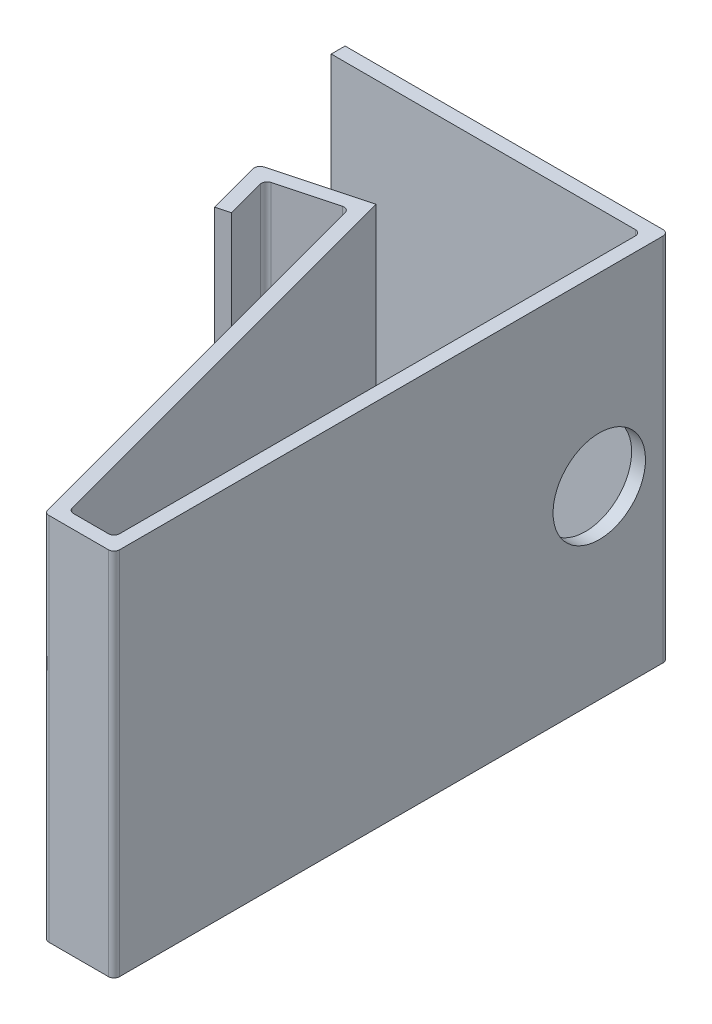
ISO-10303-21;
HEADER;
FILE_DESCRIPTION(('STEP AP214'),'2;1');
FILE_NAME('part.step','',(''),(''),'','','');
FILE_SCHEMA(('AUTOMOTIVE_DESIGN { 1 0 10303 214 1 1 1 1 }'));
ENDSEC;
DATA;
#1=APPLICATION_CONTEXT('core data for automotive mechanical design processes');
#2=APPLICATION_PROTOCOL_DEFINITION('international standard','automotive_design',2000,#1);
#3=PRODUCT_CONTEXT('',#1,'mechanical');
#4=PRODUCT('Part','Part','',(#3));
#5=PRODUCT_RELATED_PRODUCT_CATEGORY('part','',(#4));
#6=PRODUCT_DEFINITION_FORMATION('','',#4);
#7=PRODUCT_DEFINITION_CONTEXT('part definition',#1,'design');
#8=PRODUCT_DEFINITION('design','',#6,#7);
#9=PRODUCT_DEFINITION_SHAPE('','',#8);
#10=(LENGTH_UNIT() NAMED_UNIT(*) SI_UNIT(.MILLI.,.METRE.));
#11=(NAMED_UNIT(*) PLANE_ANGLE_UNIT() SI_UNIT($,.RADIAN.));
#12=(NAMED_UNIT(*) SI_UNIT($,.STERADIAN.) SOLID_ANGLE_UNIT());
#13=UNCERTAINTY_MEASURE_WITH_UNIT(LENGTH_MEASURE(1.E-05),#10,'distance_accuracy_value','');
#14=(GEOMETRIC_REPRESENTATION_CONTEXT(3) GLOBAL_UNCERTAINTY_ASSIGNED_CONTEXT((#13)) GLOBAL_UNIT_ASSIGNED_CONTEXT((#10,
#11,#12)) REPRESENTATION_CONTEXT('',''));
#15=CARTESIAN_POINT('',(0.,0.,0.));
#16=DIRECTION('',(0.,0.,1.));
#17=DIRECTION('',(1.,0.,0.));
#18=AXIS2_PLACEMENT_3D('',#15,#16,#17);
#19=CARTESIAN_POINT('',(-35.,0.,60.));
#20=DIRECTION('',(0.,1.,0.));
#21=DIRECTION('',(1.,0.,0.));
#22=AXIS2_PLACEMENT_3D('',#19,#20,#21);
#23=PLANE('',#22);
#24=CARTESIAN_POINT('',(-1.2,0.,118.8));
#25=DIRECTION('',(0.,1.,0.));
#26=DIRECTION('',(0.707106781186555,0.,0.70710678118654));
#27=AXIS2_PLACEMENT_3D('',#24,#25,#26);
#28=CIRCLE('',#27,1.2);
#29=CARTESIAN_POINT('',(-1.2,0.,120.));
#30=VERTEX_POINT('',#29);
#31=CARTESIAN_POINT('',(0.,0.,118.8));
#32=VERTEX_POINT('',#31);
#33=EDGE_CURVE('E383',#30,#32,#28,.T.);
#34=ORIENTED_EDGE('',*,*,#33,.F.);
#35=DIRECTION('',(-1.,0.,0.));
#36=VECTOR('',#35,1.);
#37=CARTESIAN_POINT('',(0.,0.,120.));
#38=LINE('',#37,#36);
#39=CARTESIAN_POINT('',(-14.0792076144252,0.,120.));
#40=VERTEX_POINT('',#39);
#41=EDGE_CURVE('E404',#30,#40,#38,.T.);
#42=ORIENTED_EDGE('',*,*,#41,.T.);
#43=CARTESIAN_POINT('',(-14.0792076144252,0.,118.8));
#44=DIRECTION('',(0.,1.,0.));
#45=DIRECTION('',(-0.608761429008726,0.,0.793353340291231));
#46=AXIS2_PLACEMENT_3D('',#43,#44,#45);
#47=CIRCLE('',#46,1.2);
#48=CARTESIAN_POINT('',(-15.2383186059721,0.,119.110582854123));
#49=VERTEX_POINT('',#48);
#50=EDGE_CURVE('E392',#49,#40,#47,.T.);
#51=ORIENTED_EDGE('',*,*,#50,.F.);
#52=DIRECTION('',(-0.258819045102521,0.,-0.965925826289068));
#53=VECTOR('',#52,1.);
#54=CARTESIAN_POINT('',(-15.,0.,120.));
#55=LINE('',#54,#53);
#56=CARTESIAN_POINT('',(-38.804844464678,0.,31.1591109915469));
#57=VERTEX_POINT('',#56);
#58=EDGE_CURVE('E502',#49,#57,#55,.T.);
#59=ORIENTED_EDGE('',*,*,#58,.T.);
#60=CARTESIAN_POINT('',(-39.9639554562249,0.,31.4696938456699));
#61=DIRECTION('',(0.,-1.,0.));
#62=DIRECTION('',(0.5,0.,-0.866025403784438));
#63=AXIS2_PLACEMENT_3D('',#60,#61,#62);
#64=CIRCLE('',#63,1.2);
#65=CARTESIAN_POINT('',(-40.2745383103479,0.,30.310582854123));
#66=VERTEX_POINT('',#65);
#67=EDGE_CURVE('E320',#66,#57,#64,.T.);
#68=ORIENTED_EDGE('',*,*,#67,.F.);
#69=DIRECTION('',(-0.965925826289069,0.,0.25881904510252));
#70=VECTOR('',#69,1.);
#71=CARTESIAN_POINT('',(-39.115427318801,0.,30.));
#72=LINE('',#71,#70);
#73=CARTESIAN_POINT('',(-52.4452037215902,0.,33.5717028224148));
#74=VERTEX_POINT('',#73);
#75=EDGE_CURVE('E346',#66,#74,#72,.T.);
#76=ORIENTED_EDGE('',*,*,#75,.T.);
#77=CARTESIAN_POINT('',(-52.1346208674672,0.,34.7308138139617));
#78=DIRECTION('',(0.,-1.,0.));
#79=DIRECTION('',(-0.866025403784442,0.,-0.5));
#80=AXIS2_PLACEMENT_3D('',#77,#78,#79);
#81=CIRCLE('',#80,1.2);
#82=CARTESIAN_POINT('',(-53.293731859014,0.,35.0413966680847));
#83=VERTEX_POINT('',#82);
#84=EDGE_CURVE('E321',#83,#74,#81,.T.);
#85=ORIENTED_EDGE('',*,*,#84,.F.);
#86=DIRECTION('',(0.258819045102521,0.,0.965925826289068));
#87=VECTOR('',#86,1.);
#88=CARTESIAN_POINT('',(-53.6043147131371,0.,33.8822856765378));
#89=LINE('',#88,#87);
#90=CARTESIAN_POINT('',(-51.0161242621119,0.,43.5415439394285));
#91=VERTEX_POINT('',#90);
#92=EDGE_CURVE('E456',#83,#91,#89,.T.);
#93=ORIENTED_EDGE('',*,*,#92,.T.);
#94=DIRECTION('',(0.965925826289068,0.,-0.258819045102522));
#95=VECTOR('',#94,1.);
#96=CARTESIAN_POINT('',(-53.9139017409791,0.,44.3180010747361));
#97=LINE('',#96,#95);
#98=CARTESIAN_POINT('',(-53.9139017409791,0.,44.3180010747361));
#99=VERTEX_POINT('',#98);
#100=EDGE_CURVE('E453',#99,#91,#97,.T.);
#101=ORIENTED_EDGE('',*,*,#100,.F.);
#102=DIRECTION('',(0.25881904510252,0.,0.965925826289069));
#103=VECTOR('',#102,1.);
#104=CARTESIAN_POINT('',(-57.2785493273118,0.,31.7609653329782));
#105=LINE('',#104,#103);
#106=CARTESIAN_POINT('',(-56.9679664731888,0.,32.920076324525));
#107=VERTEX_POINT('',#106);
#108=EDGE_CURVE('E43',#107,#99,#105,.T.);
#109=ORIENTED_EDGE('',*,*,#108,.F.);
#110=CARTESIAN_POINT('',(-55.8088554816419,0.,32.609493470402));
#111=DIRECTION('',(0.,1.,0.));
#112=DIRECTION('',(-0.866025403784439,0.,-0.5));
#113=AXIS2_PLACEMENT_3D('',#110,#111,#112);
#114=CIRCLE('',#113,1.2);
#115=CARTESIAN_POINT('',(-56.1194383357649,0.,31.4503824788551));
#116=VERTEX_POINT('',#115);
#117=EDGE_CURVE('E519',#116,#107,#114,.T.);
#118=ORIENTED_EDGE('',*,*,#117,.F.);
#119=DIRECTION('',(-0.965925826289068,0.,0.258819045102521));
#120=VECTOR('',#119,1.);
#121=CARTESIAN_POINT('',(-36.9941069752414,0.,26.3257653858252));
#122=LINE('',#121,#120);
#123=CARTESIAN_POINT('',(-36.9941069752414,0.,26.3257653858252));
#124=VERTEX_POINT('',#123);
#125=EDGE_CURVE('E437',#124,#116,#122,.T.);
#126=ORIENTED_EDGE('',*,*,#125,.F.);
#127=DIRECTION('',(-0.258819045102521,0.,-0.965925826289068));
#128=VECTOR('',#127,1.);
#129=CARTESIAN_POINT('',(-12.6980190360631,0.,117.));
#130=LINE('',#129,#128);
#131=CARTESIAN_POINT('',(-12.9363376420352,0.,116.110582854123));
#132=VERTEX_POINT('',#131);
#133=EDGE_CURVE('E524',#132,#124,#130,.T.);
#134=ORIENTED_EDGE('',*,*,#133,.F.);
#135=CARTESIAN_POINT('',(-11.7772266504884,0.,115.8));
#136=DIRECTION('',(0.,-1.,0.));
#137=DIRECTION('',(-0.608761429008716,0.,0.793353340291239));
#138=AXIS2_PLACEMENT_3D('',#135,#136,#137);
#139=CIRCLE('',#138,1.2);
#140=CARTESIAN_POINT('',(-11.7772266504884,0.,117.));
#141=VERTEX_POINT('',#140);
#142=EDGE_CURVE('E565',#141,#132,#139,.T.);
#143=ORIENTED_EDGE('',*,*,#142,.F.);
#144=DIRECTION('',(-1.,0.,0.));
#145=VECTOR('',#144,1.);
#146=CARTESIAN_POINT('',(-3.,0.,117.));
#147=LINE('',#146,#145);
#148=CARTESIAN_POINT('',(-4.2,0.,117.));
#149=VERTEX_POINT('',#148);
#150=EDGE_CURVE('E428',#149,#141,#147,.T.);
#151=ORIENTED_EDGE('',*,*,#150,.F.);
#152=CARTESIAN_POINT('',(-4.2,0.,115.8));
#153=DIRECTION('',(0.,-1.,0.));
#154=DIRECTION('',(0.707106781186545,0.,0.70710678118655));
#155=AXIS2_PLACEMENT_3D('',#152,#153,#154);
#156=CIRCLE('',#155,1.2);
#157=CARTESIAN_POINT('',(-3.,0.,115.8));
#158=VERTEX_POINT('',#157);
#159=EDGE_CURVE('E375',#158,#149,#156,.T.);
#160=ORIENTED_EDGE('',*,*,#159,.F.);
#161=DIRECTION('',(0.,0.,1.));
#162=VECTOR('',#161,1.);
#163=CARTESIAN_POINT('',(-3.,0.,3.));
#164=LINE('',#163,#162);
#165=CARTESIAN_POINT('',(-3.,0.,4.2));
#166=VERTEX_POINT('',#165);
#167=EDGE_CURVE('E359',#166,#158,#164,.T.);
#168=ORIENTED_EDGE('',*,*,#167,.F.);
#169=CARTESIAN_POINT('',(-4.2,0.,4.2));
#170=DIRECTION('',(0.,-1.,0.));
#171=DIRECTION('',(0.707106781186548,0.,-0.707106781186547));
#172=AXIS2_PLACEMENT_3D('',#169,#170,#171);
#173=CIRCLE('',#172,1.2);
#174=CARTESIAN_POINT('',(-4.2,0.,3.));
#175=VERTEX_POINT('',#174);
#176=EDGE_CURVE('E532',#175,#166,#173,.T.);
#177=ORIENTED_EDGE('',*,*,#176,.F.);
#178=DIRECTION('',(1.,0.,0.));
#179=VECTOR('',#178,1.);
#180=CARTESIAN_POINT('',(-70.,0.,3.));
#181=LINE('',#180,#179);
#182=CARTESIAN_POINT('',(-70.,0.,3.));
#183=VERTEX_POINT('',#182);
#184=EDGE_CURVE('E23',#183,#175,#181,.T.);
#185=ORIENTED_EDGE('',*,*,#184,.F.);
#186=DIRECTION('',(0.,0.,1.));
#187=VECTOR('',#186,1.);
#188=CARTESIAN_POINT('',(-70.,0.,0.));
#189=LINE('',#188,#187);
#190=CARTESIAN_POINT('',(-70.,0.,0.));
#191=VERTEX_POINT('',#190);
#192=EDGE_CURVE('E9',#191,#183,#189,.T.);
#193=ORIENTED_EDGE('',*,*,#192,.F.);
#194=DIRECTION('',(1.,0.,0.));
#195=VECTOR('',#194,1.);
#196=CARTESIAN_POINT('',(-70.,0.,0.));
#197=LINE('',#196,#195);
#198=CARTESIAN_POINT('',(-1.2,0.,0.));
#199=VERTEX_POINT('',#198);
#200=EDGE_CURVE('E299',#191,#199,#197,.T.);
#201=ORIENTED_EDGE('',*,*,#200,.T.);
#202=CARTESIAN_POINT('',(-1.2,0.,1.2));
#203=DIRECTION('',(0.,1.,0.));
#204=DIRECTION('',(0.707106781186547,0.,-0.707106781186548));
#205=AXIS2_PLACEMENT_3D('',#202,#203,#204);
#206=CIRCLE('',#205,1.2);
#207=CARTESIAN_POINT('',(0.,0.,1.2));
#208=VERTEX_POINT('',#207);
#209=EDGE_CURVE('E300',#208,#199,#206,.T.);
#210=ORIENTED_EDGE('',*,*,#209,.F.);
#211=DIRECTION('',(0.,0.,1.));
#212=VECTOR('',#211,1.);
#213=CARTESIAN_POINT('',(0.,0.,0.));
#214=LINE('',#213,#212);
#215=EDGE_CURVE('E520',#208,#32,#214,.T.);
#216=ORIENTED_EDGE('',*,*,#215,.T.);
#217=EDGE_LOOP('',(#34,#42,#51,#59,#68,#76,#85,#93,#101,#109,#118,#126,#134,#143,#151,#160,#168,
#177,#185,#193,#201,#210,#216));
#218=FACE_BOUND('',#217,.T.);
#219=ADVANCED_FACE('F15',(#218),#23,.F.);
#220=CARTESIAN_POINT('',(-70.,0.,0.));
#221=DIRECTION('',(-1.,0.,0.));
#222=DIRECTION('',(0.,0.,1.));
#223=AXIS2_PLACEMENT_3D('',#220,#221,#222);
#224=PLANE('',#223);
#225=ORIENTED_EDGE('',*,*,#192,.T.);
#226=DIRECTION('',(0.,1.,0.));
#227=VECTOR('',#226,1.);
#228=CARTESIAN_POINT('',(-70.,0.,3.));
#229=LINE('',#228,#227);
#230=CARTESIAN_POINT('',(-70.,80.,3.));
#231=VERTEX_POINT('',#230);
#232=EDGE_CURVE('E435',#183,#231,#229,.T.);
#233=ORIENTED_EDGE('',*,*,#232,.T.);
#234=DIRECTION('',(0.,0.,1.));
#235=VECTOR('',#234,1.);
#236=CARTESIAN_POINT('',(-70.,80.,0.));
#237=LINE('',#236,#235);
#238=CARTESIAN_POINT('',(-70.,80.,0.));
#239=VERTEX_POINT('',#238);
#240=EDGE_CURVE('E420',#239,#231,#237,.T.);
#241=ORIENTED_EDGE('',*,*,#240,.F.);
#242=DIRECTION('',(0.,1.,0.));
#243=VECTOR('',#242,1.);
#244=CARTESIAN_POINT('',(-70.,0.,0.));
#245=LINE('',#244,#243);
#246=EDGE_CURVE('E553',#191,#239,#245,.T.);
#247=ORIENTED_EDGE('',*,*,#246,.F.);
#248=EDGE_LOOP('',(#225,#233,#241,#247));
#249=FACE_BOUND('',#248,.T.);
#250=ADVANCED_FACE('F606',(#249),#224,.T.);
#251=CARTESIAN_POINT('',(-70.,0.,3.));
#252=DIRECTION('',(0.,0.,1.));
#253=DIRECTION('',(1.,0.,0.));
#254=AXIS2_PLACEMENT_3D('',#251,#252,#253);
#255=PLANE('',#254);
#256=DIRECTION('',(0.,-1.,0.));
#257=VECTOR('',#256,1.);
#258=CARTESIAN_POINT('',(-4.2,0.,3.));
#259=LINE('',#258,#257);
#260=CARTESIAN_POINT('',(-4.2,80.,3.));
#261=VERTEX_POINT('',#260);
#262=EDGE_CURVE('E364',#261,#175,#259,.T.);
#263=ORIENTED_EDGE('',*,*,#262,.F.);
#264=DIRECTION('',(1.,0.,0.));
#265=VECTOR('',#264,1.);
#266=CARTESIAN_POINT('',(-70.,80.,3.));
#267=LINE('',#266,#265);
#268=EDGE_CURVE('E424',#231,#261,#267,.T.);
#269=ORIENTED_EDGE('',*,*,#268,.F.);
#270=ORIENTED_EDGE('',*,*,#232,.F.);
#271=ORIENTED_EDGE('',*,*,#184,.T.);
#272=EDGE_LOOP('',(#263,#269,#270,#271));
#273=FACE_BOUND('',#272,.T.);
#274=ADVANCED_FACE('F587',(#273),#255,.T.);
#275=CARTESIAN_POINT('',(-57.2785493273118,0.,31.7609653329782));
#276=DIRECTION('',(-0.965925826289068,0.,0.25881904510252));
#277=DIRECTION('',(0.,1.,0.));
#278=AXIS2_PLACEMENT_3D('',#275,#276,#277);
#279=PLANE('',#278);
#280=DIRECTION('',(0.,1.,0.));
#281=VECTOR('',#280,1.);
#282=CARTESIAN_POINT('',(-56.9679664731888,0.,32.920076324525));
#283=LINE('',#282,#281);
#284=CARTESIAN_POINT('',(-56.9679664731888,80.,32.920076324525));
#285=VERTEX_POINT('',#284);
#286=EDGE_CURVE('E528',#107,#285,#283,.T.);
#287=ORIENTED_EDGE('',*,*,#286,.F.);
#288=ORIENTED_EDGE('',*,*,#108,.T.);
#289=DIRECTION('',(0.,1.,0.));
#290=VECTOR('',#289,1.);
#291=CARTESIAN_POINT('',(-53.9139017409791,0.,44.3180010747361));
#292=LINE('',#291,#290);
#293=CARTESIAN_POINT('',(-53.9139017409791,80.,44.3180010747361));
#294=VERTEX_POINT('',#293);
#295=EDGE_CURVE('E436',#99,#294,#292,.T.);
#296=ORIENTED_EDGE('',*,*,#295,.T.);
#297=DIRECTION('',(0.25881904510252,0.,0.965925826289069));
#298=VECTOR('',#297,1.);
#299=CARTESIAN_POINT('',(-57.2785493273118,80.,31.7609653329782));
#300=LINE('',#299,#298);
#301=EDGE_CURVE('E486',#285,#294,#300,.T.);
#302=ORIENTED_EDGE('',*,*,#301,.F.);
#303=EDGE_LOOP('',(#287,#288,#296,#302));
#304=FACE_BOUND('',#303,.T.);
#305=ADVANCED_FACE('F652',(#304),#279,.T.);
#306=CARTESIAN_POINT('',(-53.9139017409791,0.,44.3180010747361));
#307=DIRECTION('',(0.258819045102522,0.,0.965925826289068));
#308=DIRECTION('',(0.,-1.,0.));
#309=AXIS2_PLACEMENT_3D('',#306,#307,#308);
#310=PLANE('',#309);
#311=ORIENTED_EDGE('',*,*,#100,.T.);
#312=DIRECTION('',(0.,1.,0.));
#313=VECTOR('',#312,1.);
#314=CARTESIAN_POINT('',(-51.0161242621119,0.,43.5415439394285));
#315=LINE('',#314,#313);
#316=CARTESIAN_POINT('',(-51.0161242621119,80.,43.5415439394285));
#317=VERTEX_POINT('',#316);
#318=EDGE_CURVE('E523',#91,#317,#315,.T.);
#319=ORIENTED_EDGE('',*,*,#318,.T.);
#320=DIRECTION('',(0.965925826289068,0.,-0.258819045102522));
#321=VECTOR('',#320,1.);
#322=CARTESIAN_POINT('',(-53.9139017409791,80.,44.3180010747361));
#323=LINE('',#322,#321);
#324=EDGE_CURVE('E462',#294,#317,#323,.T.);
#325=ORIENTED_EDGE('',*,*,#324,.F.);
#326=ORIENTED_EDGE('',*,*,#295,.F.);
#327=EDGE_LOOP('',(#311,#319,#325,#326));
#328=FACE_BOUND('',#327,.T.);
#329=ADVANCED_FACE('F650',(#328),#310,.T.);
#330=CARTESIAN_POINT('',(-51.0161242621119,0.,43.5415439394285));
#331=DIRECTION('',(0.965925826289068,0.,-0.258819045102521));
#332=DIRECTION('',(0.,-1.,0.));
#333=AXIS2_PLACEMENT_3D('',#330,#331,#332);
#334=PLANE('',#333);
#335=DIRECTION('',(0.,-1.,0.));
#336=VECTOR('',#335,1.);
#337=CARTESIAN_POINT('',(-53.293731859014,0.,35.0413966680847));
#338=LINE('',#337,#336);
#339=CARTESIAN_POINT('',(-53.293731859014,80.,35.0413966680847));
#340=VERTEX_POINT('',#339);
#341=EDGE_CURVE('E316',#340,#83,#338,.T.);
#342=ORIENTED_EDGE('',*,*,#341,.F.);
#343=DIRECTION('',(-0.258819045102521,0.,-0.965925826289068));
#344=VECTOR('',#343,1.);
#345=CARTESIAN_POINT('',(-53.6043147131371,80.,33.8822856765378));
#346=LINE('',#345,#344);
#347=EDGE_CURVE('E457',#317,#340,#346,.T.);
#348=ORIENTED_EDGE('',*,*,#347,.F.);
#349=ORIENTED_EDGE('',*,*,#318,.F.);
#350=ORIENTED_EDGE('',*,*,#92,.F.);
#351=EDGE_LOOP('',(#342,#348,#349,#350));
#352=FACE_BOUND('',#351,.T.);
#353=ADVANCED_FACE('F647',(#352),#334,.T.);
#354=CARTESIAN_POINT('',(0.,0.,120.));
#355=DIRECTION('',(1.,0.,0.));
#356=DIRECTION('',(0.,1.,0.));
#357=AXIS2_PLACEMENT_3D('',#354,#355,#356);
#358=PLANE('',#357);
#359=CARTESIAN_POINT('',(0.,40.,15.));
#360=DIRECTION('',(-1.,0.,0.));
#361=DIRECTION('',(0.,1.,0.));
#362=AXIS2_PLACEMENT_3D('',#359,#360,#361);
#363=CIRCLE('',#362,10.);
#364=CARTESIAN_POINT('',(0.,30.,15.));
#365=VERTEX_POINT('',#364);
#366=EDGE_CURVE('E354',#365,#365,#363,.T.);
#367=ORIENTED_EDGE('',*,*,#366,.T.);
#368=EDGE_LOOP('',(#367));
#369=FACE_BOUND('',#368,.T.);
#370=DIRECTION('',(0.,1.,0.));
#371=VECTOR('',#370,1.);
#372=CARTESIAN_POINT('',(0.,0.,118.8));
#373=LINE('',#372,#371);
#374=CARTESIAN_POINT('',(0.,80.,118.8));
#375=VERTEX_POINT('',#374);
#376=EDGE_CURVE('E387',#32,#375,#373,.T.);
#377=ORIENTED_EDGE('',*,*,#376,.F.);
#378=ORIENTED_EDGE('',*,*,#215,.F.);
#379=DIRECTION('',(0.,-1.,0.));
#380=VECTOR('',#379,1.);
#381=CARTESIAN_POINT('',(0.,0.,1.2));
#382=LINE('',#381,#380);
#383=CARTESIAN_POINT('',(0.,80.,1.2));
#384=VERTEX_POINT('',#383);
#385=EDGE_CURVE('E544',#384,#208,#382,.T.);
#386=ORIENTED_EDGE('',*,*,#385,.F.);
#387=DIRECTION('',(0.,0.,-1.));
#388=VECTOR('',#387,1.);
#389=CARTESIAN_POINT('',(0.,80.,0.));
#390=LINE('',#389,#388);
#391=EDGE_CURVE('E408',#375,#384,#390,.T.);
#392=ORIENTED_EDGE('',*,*,#391,.F.);
#393=EDGE_LOOP('',(#377,#378,#386,#392));
#394=FACE_BOUND('',#393,.T.);
#395=ADVANCED_FACE('F616',(#369,#394),#358,.T.);
#396=CARTESIAN_POINT('',(-12.6980190360631,0.,117.));
#397=DIRECTION('',(0.965925826289068,0.,-0.258819045102521));
#398=DIRECTION('',(0.,-1.,0.));
#399=AXIS2_PLACEMENT_3D('',#396,#397,#398);
#400=PLANE('',#399);
#401=DIRECTION('',(0.,1.,0.));
#402=VECTOR('',#401,1.);
#403=CARTESIAN_POINT('',(-12.9363376420353,0.,116.110582854123));
#404=LINE('',#403,#402);
#405=CARTESIAN_POINT('',(-12.9363376420352,80.,116.110582854123));
#406=VERTEX_POINT('',#405);
#407=EDGE_CURVE('E571',#132,#406,#404,.T.);
#408=ORIENTED_EDGE('',*,*,#407,.F.);
#409=ORIENTED_EDGE('',*,*,#133,.T.);
#410=DIRECTION('',(0.,1.,0.));
#411=VECTOR('',#410,1.);
#412=CARTESIAN_POINT('',(-36.9941069752414,0.,26.3257653858252));
#413=LINE('',#412,#411);
#414=CARTESIAN_POINT('',(-36.9941069752414,80.,26.3257653858252));
#415=VERTEX_POINT('',#414);
#416=EDGE_CURVE('E440',#124,#415,#413,.T.);
#417=ORIENTED_EDGE('',*,*,#416,.T.);
#418=DIRECTION('',(-0.258819045102521,0.,-0.965925826289068));
#419=VECTOR('',#418,1.);
#420=CARTESIAN_POINT('',(-12.6980190360631,80.,117.));
#421=LINE('',#420,#419);
#422=EDGE_CURVE('E474',#406,#415,#421,.T.);
#423=ORIENTED_EDGE('',*,*,#422,.F.);
#424=EDGE_LOOP('',(#408,#409,#417,#423));
#425=FACE_BOUND('',#424,.T.);
#426=ADVANCED_FACE('F663',(#425),#400,.T.);
#427=CARTESIAN_POINT('',(-11.7772266504884,0.,115.8));
#428=DIRECTION('',(0.,1.,0.));
#429=DIRECTION('',(-0.608761429008716,0.,0.793353340291239));
#430=AXIS2_PLACEMENT_3D('',#427,#428,#429);
#431=CYLINDRICAL_SURFACE('',#430,1.2);
#432=ORIENTED_EDGE('',*,*,#142,.T.);
#433=ORIENTED_EDGE('',*,*,#407,.T.);
#434=CARTESIAN_POINT('',(-11.7772266504884,80.,115.8));
#435=DIRECTION('',(0.,1.,0.));
#436=DIRECTION('',(-0.608761429008716,0.,0.793353340291239));
#437=AXIS2_PLACEMENT_3D('',#434,#435,#436);
#438=CIRCLE('',#437,1.2);
#439=CARTESIAN_POINT('',(-11.7772266504884,80.,117.));
#440=VERTEX_POINT('',#439);
#441=EDGE_CURVE('E466',#406,#440,#438,.T.);
#442=ORIENTED_EDGE('',*,*,#441,.T.);
#443=DIRECTION('',(0.,-1.,0.));
#444=VECTOR('',#443,1.);
#445=CARTESIAN_POINT('',(-11.7772266504884,0.,117.));
#446=LINE('',#445,#444);
#447=EDGE_CURVE('E511',#440,#141,#446,.T.);
#448=ORIENTED_EDGE('',*,*,#447,.T.);
#449=EDGE_LOOP('',(#432,#433,#442,#448));
#450=FACE_BOUND('',#449,.T.);
#451=ADVANCED_FACE('F666',(#450),#431,.F.);
#452=CARTESIAN_POINT('',(-3.,0.,117.));
#453=DIRECTION('',(0.,0.,-1.));
#454=DIRECTION('',(0.,-1.,0.));
#455=AXIS2_PLACEMENT_3D('',#452,#453,#454);
#456=PLANE('',#455);
#457=DIRECTION('',(0.,1.,0.));
#458=VECTOR('',#457,1.);
#459=CARTESIAN_POINT('',(-4.2,0.,117.));
#460=LINE('',#459,#458);
#461=CARTESIAN_POINT('',(-4.2,80.,117.));
#462=VERTEX_POINT('',#461);
#463=EDGE_CURVE('E425',#149,#462,#460,.T.);
#464=ORIENTED_EDGE('',*,*,#463,.F.);
#465=ORIENTED_EDGE('',*,*,#150,.T.);
#466=ORIENTED_EDGE('',*,*,#447,.F.);
#467=DIRECTION('',(-1.,0.,0.));
#468=VECTOR('',#467,1.);
#469=CARTESIAN_POINT('',(-3.,80.,117.));
#470=LINE('',#469,#468);
#471=EDGE_CURVE('E452',#462,#440,#470,.T.);
#472=ORIENTED_EDGE('',*,*,#471,.F.);
#473=EDGE_LOOP('',(#464,#465,#466,#472));
#474=FACE_BOUND('',#473,.T.);
#475=ADVANCED_FACE('F670',(#474),#456,.T.);
#476=CARTESIAN_POINT('',(-4.2,0.,115.8));
#477=DIRECTION('',(0.,1.,0.));
#478=DIRECTION('',(0.707106781186545,0.,0.70710678118655));
#479=AXIS2_PLACEMENT_3D('',#476,#477,#478);
#480=CYLINDRICAL_SURFACE('',#479,1.2);
#481=ORIENTED_EDGE('',*,*,#159,.T.);
#482=ORIENTED_EDGE('',*,*,#463,.T.);
#483=CARTESIAN_POINT('',(-4.2,80.,115.8));
#484=DIRECTION('',(0.,1.,0.));
#485=DIRECTION('',(0.707106781186545,0.,0.70710678118655));
#486=AXIS2_PLACEMENT_3D('',#483,#484,#485);
#487=CIRCLE('',#486,1.2);
#488=CARTESIAN_POINT('',(-3.,80.,115.8));
#489=VERTEX_POINT('',#488);
#490=EDGE_CURVE('E448',#462,#489,#487,.T.);
#491=ORIENTED_EDGE('',*,*,#490,.T.);
#492=DIRECTION('',(0.,-1.,0.));
#493=VECTOR('',#492,1.);
#494=CARTESIAN_POINT('',(-3.,0.,115.8));
#495=LINE('',#494,#493);
#496=EDGE_CURVE('E363',#489,#158,#495,.T.);
#497=ORIENTED_EDGE('',*,*,#496,.T.);
#498=EDGE_LOOP('',(#481,#482,#491,#497));
#499=FACE_BOUND('',#498,.T.);
#500=ADVANCED_FACE('F672',(#499),#480,.F.);
#501=CARTESIAN_POINT('',(-3.,0.,3.));
#502=DIRECTION('',(-1.,0.,0.));
#503=DIRECTION('',(0.,0.,1.));
#504=AXIS2_PLACEMENT_3D('',#501,#502,#503);
#505=PLANE('',#504);
#506=CARTESIAN_POINT('',(-3.,40.,15.));
#507=DIRECTION('',(1.,0.,0.));
#508=DIRECTION('',(0.,1.,0.));
#509=AXIS2_PLACEMENT_3D('',#506,#507,#508);
#510=CIRCLE('',#509,10.);
#511=CARTESIAN_POINT('',(-3.,30.,15.));
#512=VERTEX_POINT('',#511);
#513=EDGE_CURVE('E368',#512,#512,#510,.T.);
#514=ORIENTED_EDGE('',*,*,#513,.T.);
#515=EDGE_LOOP('',(#514));
#516=FACE_BOUND('',#515,.T.);
#517=DIRECTION('',(0.,1.,0.));
#518=VECTOR('',#517,1.);
#519=CARTESIAN_POINT('',(-3.,0.,4.2));
#520=LINE('',#519,#518);
#521=CARTESIAN_POINT('',(-3.,80.,4.2));
#522=VERTEX_POINT('',#521);
#523=EDGE_CURVE('E529',#166,#522,#520,.T.);
#524=ORIENTED_EDGE('',*,*,#523,.F.);
#525=ORIENTED_EDGE('',*,*,#167,.T.);
#526=ORIENTED_EDGE('',*,*,#496,.F.);
#527=DIRECTION('',(0.,0.,1.));
#528=VECTOR('',#527,1.);
#529=CARTESIAN_POINT('',(-3.,80.,3.));
#530=LINE('',#529,#528);
#531=EDGE_CURVE('E444',#522,#489,#530,.T.);
#532=ORIENTED_EDGE('',*,*,#531,.F.);
#533=EDGE_LOOP('',(#524,#525,#526,#532));
#534=FACE_BOUND('',#533,.T.);
#535=ADVANCED_FACE('F598',(#516,#534),#505,.T.);
#536=CARTESIAN_POINT('',(-4.2,0.,4.2));
#537=DIRECTION('',(0.,1.,0.));
#538=DIRECTION('',(0.707106781186548,0.,-0.707106781186547));
#539=AXIS2_PLACEMENT_3D('',#536,#537,#538);
#540=CYLINDRICAL_SURFACE('',#539,1.2);
#541=ORIENTED_EDGE('',*,*,#176,.T.);
#542=ORIENTED_EDGE('',*,*,#523,.T.);
#543=CARTESIAN_POINT('',(-4.2,80.,4.2));
#544=DIRECTION('',(0.,1.,0.));
#545=DIRECTION('',(0.707106781186548,0.,-0.707106781186547));
#546=AXIS2_PLACEMENT_3D('',#543,#544,#545);
#547=CIRCLE('',#546,1.2);
#548=EDGE_CURVE('E432',#522,#261,#547,.T.);
#549=ORIENTED_EDGE('',*,*,#548,.T.);
#550=ORIENTED_EDGE('',*,*,#262,.T.);
#551=EDGE_LOOP('',(#541,#542,#549,#550));
#552=FACE_BOUND('',#551,.T.);
#553=ADVANCED_FACE('F592',(#552),#540,.F.);
#554=CARTESIAN_POINT('',(0.,0.,0.));
#555=DIRECTION('',(0.,0.,-1.));
#556=DIRECTION('',(0.,-1.,0.));
#557=AXIS2_PLACEMENT_3D('',#554,#555,#556);
#558=PLANE('',#557);
#559=DIRECTION('',(0.,1.,0.));
#560=VECTOR('',#559,1.);
#561=CARTESIAN_POINT('',(-1.2,0.,0.));
#562=LINE('',#561,#560);
#563=CARTESIAN_POINT('',(-1.2,80.,0.));
#564=VERTEX_POINT('',#563);
#565=EDGE_CURVE('E296',#199,#564,#562,.T.);
#566=ORIENTED_EDGE('',*,*,#565,.F.);
#567=ORIENTED_EDGE('',*,*,#200,.F.);
#568=ORIENTED_EDGE('',*,*,#246,.T.);
#569=DIRECTION('',(-1.,0.,0.));
#570=VECTOR('',#569,1.);
#571=CARTESIAN_POINT('',(-70.,80.,0.));
#572=LINE('',#571,#570);
#573=EDGE_CURVE('E416',#564,#239,#572,.T.);
#574=ORIENTED_EDGE('',*,*,#573,.F.);
#575=EDGE_LOOP('',(#566,#567,#568,#574));
#576=FACE_BOUND('',#575,.T.);
#577=ADVANCED_FACE('F610',(#576),#558,.T.);
#578=CARTESIAN_POINT('',(-1.2,0.,1.2));
#579=DIRECTION('',(0.,1.,0.));
#580=DIRECTION('',(0.707106781186547,0.,-0.707106781186548));
#581=AXIS2_PLACEMENT_3D('',#578,#579,#580);
#582=CYLINDRICAL_SURFACE('',#581,1.2);
#583=CARTESIAN_POINT('',(-1.2,80.,1.2));
#584=DIRECTION('',(0.,-1.,0.));
#585=DIRECTION('',(0.707106781186547,0.,-0.707106781186548));
#586=AXIS2_PLACEMENT_3D('',#583,#584,#585);
#587=CIRCLE('',#586,1.2);
#588=EDGE_CURVE('E412',#564,#384,#587,.T.);
#589=ORIENTED_EDGE('',*,*,#588,.T.);
#590=ORIENTED_EDGE('',*,*,#385,.T.);
#591=ORIENTED_EDGE('',*,*,#209,.T.);
#592=ORIENTED_EDGE('',*,*,#565,.T.);
#593=EDGE_LOOP('',(#589,#590,#591,#592));
#594=FACE_BOUND('',#593,.T.);
#595=ADVANCED_FACE('F614',(#594),#582,.T.);
#596=CARTESIAN_POINT('',(-39.9639554562249,0.,31.4696938456699));
#597=DIRECTION('',(0.,1.,0.));
#598=DIRECTION('',(0.5,0.,-0.866025403784438));
#599=AXIS2_PLACEMENT_3D('',#596,#597,#598);
#600=CYLINDRICAL_SURFACE('',#599,1.2);
#601=ORIENTED_EDGE('',*,*,#67,.T.);
#602=DIRECTION('',(0.,1.,0.));
#603=VECTOR('',#602,1.);
#604=CARTESIAN_POINT('',(-38.804844464678,0.,31.1591109915469));
#605=LINE('',#604,#603);
#606=CARTESIAN_POINT('',(-38.804844464678,80.,31.1591109915469));
#607=VERTEX_POINT('',#606);
#608=EDGE_CURVE('E499',#57,#607,#605,.T.);
#609=ORIENTED_EDGE('',*,*,#608,.T.);
#610=CARTESIAN_POINT('',(-39.9639554562249,80.,31.4696938456699));
#611=DIRECTION('',(0.,1.,0.));
#612=DIRECTION('',(0.5,0.,-0.866025403784438));
#613=AXIS2_PLACEMENT_3D('',#610,#611,#612);
#614=CIRCLE('',#613,1.2);
#615=CARTESIAN_POINT('',(-40.2745383103479,80.,30.310582854123));
#616=VERTEX_POINT('',#615);
#617=EDGE_CURVE('E470',#607,#616,#614,.T.);
#618=ORIENTED_EDGE('',*,*,#617,.T.);
#619=DIRECTION('',(0.,-1.,0.));
#620=VECTOR('',#619,1.);
#621=CARTESIAN_POINT('',(-40.2745383103479,0.,30.310582854123));
#622=LINE('',#621,#620);
#623=CARTESIAN_POINT('',(-40.2745383103479,41.6,30.310582854123));
#624=VERTEX_POINT('',#623);
#625=EDGE_CURVE('E332',#616,#624,#622,.T.);
#626=ORIENTED_EDGE('',*,*,#625,.T.);
#627=DIRECTION('',(0.,-1.,0.));
#628=VECTOR('',#627,1.);
#629=CARTESIAN_POINT('',(-40.2745383103479,0.,30.310582854123));
#630=LINE('',#629,#628);
#631=CARTESIAN_POINT('',(-40.2745383103479,38.4,30.310582854123));
#632=VERTEX_POINT('',#631);
#633=EDGE_CURVE('E284',#624,#632,#630,.T.);
#634=ORIENTED_EDGE('',*,*,#633,.T.);
#635=DIRECTION('',(0.,-1.,0.));
#636=VECTOR('',#635,1.);
#637=CARTESIAN_POINT('',(-40.2745383103479,0.,30.310582854123));
#638=LINE('',#637,#636);
#639=EDGE_CURVE('E350',#632,#66,#638,.T.);
#640=ORIENTED_EDGE('',*,*,#639,.T.);
#641=EDGE_LOOP('',(#601,#609,#618,#626,#634,#640));
#642=FACE_BOUND('',#641,.T.);
#643=ADVANCED_FACE('F636',(#642),#600,.F.);
#644=CARTESIAN_POINT('',(-52.1346208674672,0.,34.7308138139617));
#645=DIRECTION('',(0.,1.,0.));
#646=DIRECTION('',(-0.866025403784442,0.,-0.5));
#647=AXIS2_PLACEMENT_3D('',#644,#645,#646);
#648=CYLINDRICAL_SURFACE('',#647,1.2);
#649=ORIENTED_EDGE('',*,*,#84,.T.);
#650=DIRECTION('',(0.,1.,0.));
#651=VECTOR('',#650,1.);
#652=CARTESIAN_POINT('',(-52.4452037215902,0.,33.5717028224148));
#653=LINE('',#652,#651);
#654=CARTESIAN_POINT('',(-52.4452037215902,38.4,33.5717028224148));
#655=VERTEX_POINT('',#654);
#656=EDGE_CURVE('E343',#74,#655,#653,.T.);
#657=ORIENTED_EDGE('',*,*,#656,.T.);
#658=DIRECTION('',(0.,1.,0.));
#659=VECTOR('',#658,1.);
#660=CARTESIAN_POINT('',(-52.4452037215902,0.,33.5717028224148));
#661=LINE('',#660,#659);
#662=CARTESIAN_POINT('',(-52.4452037215902,41.6,33.5717028224148));
#663=VERTEX_POINT('',#662);
#664=EDGE_CURVE('E309',#655,#663,#661,.T.);
#665=ORIENTED_EDGE('',*,*,#664,.T.);
#666=DIRECTION('',(0.,1.,0.));
#667=VECTOR('',#666,1.);
#668=CARTESIAN_POINT('',(-52.4452037215902,0.,33.5717028224148));
#669=LINE('',#668,#667);
#670=CARTESIAN_POINT('',(-52.4452037215902,80.,33.5717028224148));
#671=VERTEX_POINT('',#670);
#672=EDGE_CURVE('E339',#663,#671,#669,.T.);
#673=ORIENTED_EDGE('',*,*,#672,.T.);
#674=CARTESIAN_POINT('',(-52.1346208674672,80.,34.7308138139617));
#675=DIRECTION('',(0.,1.,0.));
#676=DIRECTION('',(-0.866025403784442,0.,-0.5));
#677=AXIS2_PLACEMENT_3D('',#674,#675,#676);
#678=CIRCLE('',#677,1.2);
#679=EDGE_CURVE('E461',#671,#340,#678,.T.);
#680=ORIENTED_EDGE('',*,*,#679,.T.);
#681=ORIENTED_EDGE('',*,*,#341,.T.);
#682=EDGE_LOOP('',(#649,#657,#665,#673,#680,#681));
#683=FACE_BOUND('',#682,.T.);
#684=ADVANCED_FACE('F640',(#683),#648,.F.);
#685=CARTESIAN_POINT('',(-36.9941069752414,0.,26.3257653858252));
#686=DIRECTION('',(-0.258819045102521,0.,-0.965925826289068));
#687=DIRECTION('',(-0.965925826289068,0.,0.258819045102521));
#688=AXIS2_PLACEMENT_3D('',#685,#686,#687);
#689=PLANE('',#688);
#690=DIRECTION('',(0.,-1.,0.));
#691=VECTOR('',#690,1.);
#692=CARTESIAN_POINT('',(-53.2216608568977,19.2,30.6739253435476));
#693=LINE('',#692,#691);
#694=CARTESIAN_POINT('',(-53.2216608568977,41.6,30.6739253435476));
#695=VERTEX_POINT('',#694);
#696=CARTESIAN_POINT('',(-53.2216608568977,38.4,30.6739253435476));
#697=VERTEX_POINT('',#696);
#698=EDGE_CURVE('E267',#695,#697,#693,.T.);
#699=ORIENTED_EDGE('',*,*,#698,.T.);
#700=CARTESIAN_POINT('',(-47.1363281512766,40.,29.0433653594017));
#701=DIRECTION('',(0.258819045102521,0.,0.965925826289068));
#702=DIRECTION('',(0.,1.,0.));
#703=AXIS2_PLACEMENT_3D('',#700,#701,#702);
#704=CIRCLE('',#703,6.5);
#705=CARTESIAN_POINT('',(-41.0509954456555,38.4,27.4128053752558));
#706=VERTEX_POINT('',#705);
#707=EDGE_CURVE('E260',#697,#706,#704,.T.);
#708=ORIENTED_EDGE('',*,*,#707,.T.);
#709=DIRECTION('',(0.,1.,0.));
#710=VECTOR('',#709,1.);
#711=CARTESIAN_POINT('',(-41.0509954456555,20.8,27.4128053752558));
#712=LINE('',#711,#710);
#713=CARTESIAN_POINT('',(-41.0509954456555,41.6,27.4128053752558));
#714=VERTEX_POINT('',#713);
#715=EDGE_CURVE('E266',#706,#714,#712,.T.);
#716=ORIENTED_EDGE('',*,*,#715,.T.);
#717=CARTESIAN_POINT('',(-47.1363281512766,40.,29.0433653594017));
#718=DIRECTION('',(0.258819045102521,0.,0.965925826289068));
#719=DIRECTION('',(0.,1.,0.));
#720=AXIS2_PLACEMENT_3D('',#717,#718,#719);
#721=CIRCLE('',#720,6.5);
#722=EDGE_CURVE('E301',#714,#695,#721,.T.);
#723=ORIENTED_EDGE('',*,*,#722,.T.);
#724=EDGE_LOOP('',(#699,#708,#716,#723));
#725=FACE_BOUND('',#724,.T.);
#726=DIRECTION('',(0.,-1.,0.));
#727=VECTOR('',#726,1.);
#728=CARTESIAN_POINT('',(-56.1194383357649,0.,31.4503824788551));
#729=LINE('',#728,#727);
#730=CARTESIAN_POINT('',(-56.1194383357649,80.,31.4503824788551));
#731=VERTEX_POINT('',#730);
#732=EDGE_CURVE('E515',#731,#116,#729,.T.);
#733=ORIENTED_EDGE('',*,*,#732,.F.);
#734=DIRECTION('',(-0.965925826289068,0.,0.258819045102521));
#735=VECTOR('',#734,1.);
#736=CARTESIAN_POINT('',(-36.9941069752414,80.,26.3257653858252));
#737=LINE('',#736,#735);
#738=EDGE_CURVE('E478',#415,#731,#737,.T.);
#739=ORIENTED_EDGE('',*,*,#738,.F.);
#740=ORIENTED_EDGE('',*,*,#416,.F.);
#741=ORIENTED_EDGE('',*,*,#125,.T.);
#742=EDGE_LOOP('',(#733,#739,#740,#741));
#743=FACE_BOUND('',#742,.T.);
#744=ADVANCED_FACE('F262',(#725,#743),#689,.T.);
#745=CARTESIAN_POINT('',(-55.8088554816419,0.,32.609493470402));
#746=DIRECTION('',(0.,1.,0.));
#747=DIRECTION('',(-0.866025403784439,0.,-0.5));
#748=AXIS2_PLACEMENT_3D('',#745,#746,#747);
#749=CYLINDRICAL_SURFACE('',#748,1.2);
#750=CARTESIAN_POINT('',(-55.8088554816419,80.,32.609493470402));
#751=DIRECTION('',(0.,-1.,0.));
#752=DIRECTION('',(-0.866025403784439,0.,-0.5));
#753=AXIS2_PLACEMENT_3D('',#750,#751,#752);
#754=CIRCLE('',#753,1.2);
#755=EDGE_CURVE('E482',#285,#731,#754,.T.);
#756=ORIENTED_EDGE('',*,*,#755,.T.);
#757=ORIENTED_EDGE('',*,*,#732,.T.);
#758=ORIENTED_EDGE('',*,*,#117,.T.);
#759=ORIENTED_EDGE('',*,*,#286,.T.);
#760=EDGE_LOOP('',(#756,#757,#758,#759));
#761=FACE_BOUND('',#760,.T.);
#762=ADVANCED_FACE('F656',(#761),#749,.T.);
#763=CARTESIAN_POINT('',(-39.115427318801,0.,30.));
#764=DIRECTION('',(-0.965925826289068,0.,0.258819045102521));
#765=DIRECTION('',(0.,1.,0.));
#766=AXIS2_PLACEMENT_3D('',#763,#764,#765);
#767=PLANE('',#766);
#768=DIRECTION('',(0.,-1.,0.));
#769=VECTOR('',#768,1.);
#770=CARTESIAN_POINT('',(-15.2383186059721,0.,119.110582854123));
#771=LINE('',#770,#769);
#772=CARTESIAN_POINT('',(-15.2383186059721,80.,119.110582854123));
#773=VERTEX_POINT('',#772);
#774=EDGE_CURVE('E388',#773,#49,#771,.T.);
#775=ORIENTED_EDGE('',*,*,#774,.F.);
#776=DIRECTION('',(0.258819045102521,0.,0.965925826289068));
#777=VECTOR('',#776,1.);
#778=CARTESIAN_POINT('',(-15.,80.,120.));
#779=LINE('',#778,#777);
#780=EDGE_CURVE('E495',#607,#773,#779,.T.);
#781=ORIENTED_EDGE('',*,*,#780,.F.);
#782=ORIENTED_EDGE('',*,*,#608,.F.);
#783=ORIENTED_EDGE('',*,*,#58,.F.);
#784=EDGE_LOOP('',(#775,#781,#782,#783));
#785=FACE_BOUND('',#784,.T.);
#786=ADVANCED_FACE('F629',(#785),#767,.T.);
#787=CARTESIAN_POINT('',(-14.0792076144252,0.,118.8));
#788=DIRECTION('',(0.,1.,0.));
#789=DIRECTION('',(-0.608761429008726,0.,0.793353340291231));
#790=AXIS2_PLACEMENT_3D('',#787,#788,#789);
#791=CYLINDRICAL_SURFACE('',#790,1.2);
#792=CARTESIAN_POINT('',(-14.0792076144252,80.,118.8));
#793=DIRECTION('',(0.,-1.,0.));
#794=DIRECTION('',(-0.608761429008726,0.,0.793353340291231));
#795=AXIS2_PLACEMENT_3D('',#792,#793,#794);
#796=CIRCLE('',#795,1.2);
#797=CARTESIAN_POINT('',(-14.0792076144252,80.,120.));
#798=VERTEX_POINT('',#797);
#799=EDGE_CURVE('E393',#798,#773,#796,.T.);
#800=ORIENTED_EDGE('',*,*,#799,.T.);
#801=ORIENTED_EDGE('',*,*,#774,.T.);
#802=ORIENTED_EDGE('',*,*,#50,.T.);
#803=DIRECTION('',(0.,1.,0.));
#804=VECTOR('',#803,1.);
#805=CARTESIAN_POINT('',(-14.0792076144252,0.,120.));
#806=LINE('',#805,#804);
#807=EDGE_CURVE('E400',#40,#798,#806,.T.);
#808=ORIENTED_EDGE('',*,*,#807,.T.);
#809=EDGE_LOOP('',(#800,#801,#802,#808));
#810=FACE_BOUND('',#809,.T.);
#811=ADVANCED_FACE('F626',(#810),#791,.T.);
#812=CARTESIAN_POINT('',(-35.,80.,60.));
#813=DIRECTION('',(0.,1.,0.));
#814=DIRECTION('',(1.,0.,0.));
#815=AXIS2_PLACEMENT_3D('',#812,#813,#814);
#816=PLANE('',#815);
#817=CARTESIAN_POINT('',(-1.2,80.,118.8));
#818=DIRECTION('',(0.,-1.,0.));
#819=DIRECTION('',(0.707106781186555,0.,0.70710678118654));
#820=AXIS2_PLACEMENT_3D('',#817,#818,#819);
#821=CIRCLE('',#820,1.2);
#822=CARTESIAN_POINT('',(-1.2,80.,120.));
#823=VERTEX_POINT('',#822);
#824=EDGE_CURVE('E371',#375,#823,#821,.T.);
#825=ORIENTED_EDGE('',*,*,#824,.F.);
#826=ORIENTED_EDGE('',*,*,#391,.T.);
#827=ORIENTED_EDGE('',*,*,#588,.F.);
#828=ORIENTED_EDGE('',*,*,#573,.T.);
#829=ORIENTED_EDGE('',*,*,#240,.T.);
#830=ORIENTED_EDGE('',*,*,#268,.T.);
#831=ORIENTED_EDGE('',*,*,#548,.F.);
#832=ORIENTED_EDGE('',*,*,#531,.T.);
#833=ORIENTED_EDGE('',*,*,#490,.F.);
#834=ORIENTED_EDGE('',*,*,#471,.T.);
#835=ORIENTED_EDGE('',*,*,#441,.F.);
#836=ORIENTED_EDGE('',*,*,#422,.T.);
#837=ORIENTED_EDGE('',*,*,#738,.T.);
#838=ORIENTED_EDGE('',*,*,#755,.F.);
#839=ORIENTED_EDGE('',*,*,#301,.T.);
#840=ORIENTED_EDGE('',*,*,#324,.T.);
#841=ORIENTED_EDGE('',*,*,#347,.T.);
#842=ORIENTED_EDGE('',*,*,#679,.F.);
#843=DIRECTION('',(0.965925826289069,0.,-0.25881904510252));
#844=VECTOR('',#843,1.);
#845=CARTESIAN_POINT('',(-39.115427318801,80.,30.));
#846=LINE('',#845,#844);
#847=EDGE_CURVE('E335',#671,#616,#846,.T.);
#848=ORIENTED_EDGE('',*,*,#847,.T.);
#849=ORIENTED_EDGE('',*,*,#617,.F.);
#850=ORIENTED_EDGE('',*,*,#780,.T.);
#851=ORIENTED_EDGE('',*,*,#799,.F.);
#852=DIRECTION('',(1.,0.,0.));
#853=VECTOR('',#852,1.);
#854=CARTESIAN_POINT('',(0.,80.,120.));
#855=LINE('',#854,#853);
#856=EDGE_CURVE('E397',#798,#823,#855,.T.);
#857=ORIENTED_EDGE('',*,*,#856,.T.);
#858=EDGE_LOOP('',(#825,#826,#827,#828,#829,#830,#831,#832,#833,#834,#835,#836,#837,#838,#839,
#840,#841,#842,#848,#849,#850,#851,#857));
#859=FACE_BOUND('',#858,.T.);
#860=ADVANCED_FACE('F602',(#859),#816,.T.);
#861=CARTESIAN_POINT('',(-15.,0.,120.));
#862=DIRECTION('',(0.,0.,1.));
#863=DIRECTION('',(1.,0.,0.));
#864=AXIS2_PLACEMENT_3D('',#861,#862,#863);
#865=PLANE('',#864);
#866=DIRECTION('',(0.,-1.,0.));
#867=VECTOR('',#866,1.);
#868=CARTESIAN_POINT('',(-1.2,0.,120.));
#869=LINE('',#868,#867);
#870=EDGE_CURVE('E379',#823,#30,#869,.T.);
#871=ORIENTED_EDGE('',*,*,#870,.F.);
#872=ORIENTED_EDGE('',*,*,#856,.F.);
#873=ORIENTED_EDGE('',*,*,#807,.F.);
#874=ORIENTED_EDGE('',*,*,#41,.F.);
#875=EDGE_LOOP('',(#871,#872,#873,#874));
#876=FACE_BOUND('',#875,.T.);
#877=ADVANCED_FACE('F624',(#876),#865,.T.);
#878=CARTESIAN_POINT('',(-1.2,0.,118.8));
#879=DIRECTION('',(0.,1.,0.));
#880=DIRECTION('',(0.707106781186555,0.,0.70710678118654));
#881=AXIS2_PLACEMENT_3D('',#878,#879,#880);
#882=CYLINDRICAL_SURFACE('',#881,1.2);
#883=ORIENTED_EDGE('',*,*,#824,.T.);
#884=ORIENTED_EDGE('',*,*,#870,.T.);
#885=ORIENTED_EDGE('',*,*,#33,.T.);
#886=ORIENTED_EDGE('',*,*,#376,.T.);
#887=EDGE_LOOP('',(#883,#884,#885,#886));
#888=FACE_BOUND('',#887,.T.);
#889=ADVANCED_FACE('F618',(#888),#882,.T.);
#890=CARTESIAN_POINT('',(0.,40.,15.));
#891=DIRECTION('',(-1.,0.,0.));
#892=DIRECTION('',(0.,1.,0.));
#893=AXIS2_PLACEMENT_3D('',#890,#891,#892);
#894=CYLINDRICAL_SURFACE('',#893,10.);
#895=ORIENTED_EDGE('',*,*,#366,.F.);
#896=DIRECTION('',(-1.,0.,0.));
#897=VECTOR('',#896,1.);
#898=CARTESIAN_POINT('',(0.,30.,15.));
#899=LINE('',#898,#897);
#900=EDGE_CURVE('E358',#365,#512,#899,.T.);
#901=ORIENTED_EDGE('',*,*,#900,.T.);
#902=ORIENTED_EDGE('',*,*,#513,.F.);
#903=ORIENTED_EDGE('',*,*,#900,.F.);
#904=EDGE_LOOP('',(#895,#901,#902,#903));
#905=FACE_BOUND('',#904,.T.);
#906=ADVANCED_FACE('F840',(#905),#894,.F.);
#907=CARTESIAN_POINT('',(-53.6043147131371,0.,33.8822856765378));
#908=DIRECTION('',(0.25881904510252,0.,0.965925826289069));
#909=DIRECTION('',(0.,-1.,0.));
#910=AXIS2_PLACEMENT_3D('',#907,#908,#909);
#911=PLANE('',#910);
#912=CARTESIAN_POINT('',(-46.359871015969,40.,31.9411428382689));
#913=DIRECTION('',(-0.25881904510252,0.,-0.965925826289069));
#914=DIRECTION('',(0.,1.,0.));
#915=AXIS2_PLACEMENT_3D('',#912,#913,#914);
#916=CIRCLE('',#915,6.5);
#917=EDGE_CURVE('E272',#632,#655,#916,.T.);
#918=ORIENTED_EDGE('',*,*,#917,.T.);
#919=ORIENTED_EDGE('',*,*,#656,.F.);
#920=ORIENTED_EDGE('',*,*,#75,.F.);
#921=ORIENTED_EDGE('',*,*,#639,.F.);
#922=EDGE_LOOP('',(#918,#919,#920,#921));
#923=FACE_BOUND('',#922,.T.);
#924=ADVANCED_FACE('F638',(#923),#911,.T.);
#925=CARTESIAN_POINT('',(-53.6043147131371,0.,33.8822856765378));
#926=DIRECTION('',(0.25881904510252,0.,0.965925826289069));
#927=DIRECTION('',(0.,-1.,0.));
#928=AXIS2_PLACEMENT_3D('',#925,#926,#927);
#929=PLANE('',#928);
#930=CARTESIAN_POINT('',(-46.359871015969,40.,31.9411428382689));
#931=DIRECTION('',(-0.25881904510252,0.,-0.965925826289069));
#932=DIRECTION('',(0.,1.,0.));
#933=AXIS2_PLACEMENT_3D('',#930,#931,#932);
#934=CIRCLE('',#933,6.5);
#935=EDGE_CURVE('E303',#663,#624,#934,.T.);
#936=ORIENTED_EDGE('',*,*,#935,.T.);
#937=ORIENTED_EDGE('',*,*,#625,.F.);
#938=ORIENTED_EDGE('',*,*,#847,.F.);
#939=ORIENTED_EDGE('',*,*,#672,.F.);
#940=EDGE_LOOP('',(#936,#937,#938,#939));
#941=FACE_BOUND('',#940,.T.);
#942=ADVANCED_FACE('F860',(#941),#929,.T.);
#943=CARTESIAN_POINT('',(-46.359871015969,40.,31.9411428382689));
#944=DIRECTION('',(-0.25881904510252,0.,-0.965925826289069));
#945=DIRECTION('',(0.,-1.,0.));
#946=AXIS2_PLACEMENT_3D('',#943,#944,#945);
#947=CYLINDRICAL_SURFACE('',#946,6.5);
#948=ORIENTED_EDGE('',*,*,#707,.F.);
#949=DIRECTION('',(-0.25881904510252,0.,-0.965925826289069));
#950=VECTOR('',#949,1.);
#951=CARTESIAN_POINT('',(-52.4452037215902,38.4,33.5717028224148));
#952=LINE('',#951,#950);
#953=EDGE_CURVE('E273',#655,#697,#952,.T.);
#954=ORIENTED_EDGE('',*,*,#953,.F.);
#955=ORIENTED_EDGE('',*,*,#917,.F.);
#956=DIRECTION('',(-0.25881904510252,0.,-0.965925826289069));
#957=VECTOR('',#956,1.);
#958=CARTESIAN_POINT('',(-40.2745383103479,38.4,30.310582854123));
#959=LINE('',#958,#957);
#960=EDGE_CURVE('E277',#632,#706,#959,.T.);
#961=ORIENTED_EDGE('',*,*,#960,.T.);
#962=EDGE_LOOP('',(#948,#954,#955,#961));
#963=FACE_BOUND('',#962,.T.);
#964=ADVANCED_FACE('F278',(#963),#947,.F.);
#965=CARTESIAN_POINT('',(-52.4452037215902,38.4,33.5717028224148));
#966=DIRECTION('',(-0.965925826289069,0.,0.25881904510252));
#967=DIRECTION('',(0.,1.,0.));
#968=AXIS2_PLACEMENT_3D('',#965,#966,#967);
#969=PLANE('',#968);
#970=ORIENTED_EDGE('',*,*,#698,.F.);
#971=DIRECTION('',(-0.25881904510252,0.,-0.965925826289069));
#972=VECTOR('',#971,1.);
#973=CARTESIAN_POINT('',(-52.4452037215902,41.6,33.5717028224148));
#974=LINE('',#973,#972);
#975=EDGE_CURVE('E315',#663,#695,#974,.T.);
#976=ORIENTED_EDGE('',*,*,#975,.F.);
#977=ORIENTED_EDGE('',*,*,#664,.F.);
#978=ORIENTED_EDGE('',*,*,#953,.T.);
#979=EDGE_LOOP('',(#970,#976,#977,#978));
#980=FACE_BOUND('',#979,.T.);
#981=ADVANCED_FACE('F880',(#980),#969,.F.);
#982=CARTESIAN_POINT('',(-46.359871015969,40.,31.9411428382689));
#983=DIRECTION('',(-0.25881904510252,0.,-0.965925826289069));
#984=DIRECTION('',(0.,1.,0.));
#985=AXIS2_PLACEMENT_3D('',#982,#983,#984);
#986=CYLINDRICAL_SURFACE('',#985,6.5);
#987=ORIENTED_EDGE('',*,*,#722,.F.);
#988=DIRECTION('',(-0.25881904510252,0.,-0.965925826289069));
#989=VECTOR('',#988,1.);
#990=CARTESIAN_POINT('',(-40.2745383103479,41.6,30.310582854123));
#991=LINE('',#990,#989);
#992=EDGE_CURVE('E289',#624,#714,#991,.T.);
#993=ORIENTED_EDGE('',*,*,#992,.F.);
#994=ORIENTED_EDGE('',*,*,#935,.F.);
#995=ORIENTED_EDGE('',*,*,#975,.T.);
#996=EDGE_LOOP('',(#987,#993,#994,#995));
#997=FACE_BOUND('',#996,.T.);
#998=ADVANCED_FACE('F889',(#997),#986,.F.);
#999=CARTESIAN_POINT('',(-40.2745383103479,41.6,30.310582854123));
#1000=DIRECTION('',(0.965925826289069,0.,-0.25881904510252));
#1001=DIRECTION('',(0.,-1.,0.));
#1002=AXIS2_PLACEMENT_3D('',#999,#1000,#1001);
#1003=PLANE('',#1002);
#1004=ORIENTED_EDGE('',*,*,#715,.F.);
#1005=ORIENTED_EDGE('',*,*,#960,.F.);
#1006=ORIENTED_EDGE('',*,*,#633,.F.);
#1007=ORIENTED_EDGE('',*,*,#992,.T.);
#1008=EDGE_LOOP('',(#1004,#1005,#1006,#1007));
#1009=FACE_BOUND('',#1008,.T.);
#1010=ADVANCED_FACE('F287',(#1009),#1003,.F.);
#1011=CLOSED_SHELL('',(#219,#250,#274,#305,#329,#353,#395,#426,#451,#475,#500,#535,#553,#577,
#595,#643,#684,#744,#762,#786,#811,#860,#877,#889,#906,#924,#942,#964,#981,#998,#1010));
#1012=MANIFOLD_SOLID_BREP('B1',#1011);
#1013=ADVANCED_BREP_SHAPE_REPRESENTATION('',(#18,#1012),#14);
#1014=SHAPE_DEFINITION_REPRESENTATION(#9,#1013);
ENDSEC;
END-ISO-10303-21;
